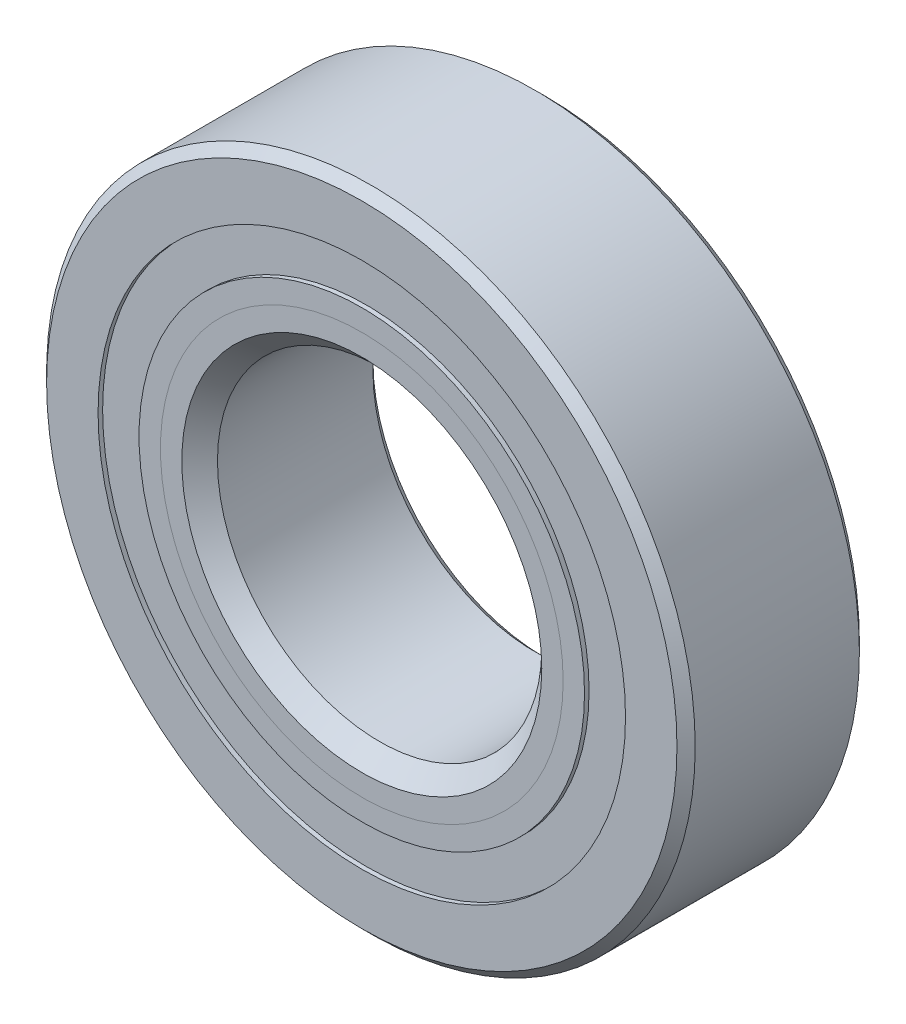
ISO-10303-21;
HEADER;
FILE_DESCRIPTION(('STEP AP214'),'2;1');
FILE_NAME('part.step','',(''),(''),'','','');
FILE_SCHEMA(('AUTOMOTIVE_DESIGN { 1 0 10303 214 1 1 1 1 }'));
ENDSEC;
DATA;
#1=APPLICATION_CONTEXT('core data for automotive mechanical design processes');
#2=APPLICATION_PROTOCOL_DEFINITION('international standard','automotive_design',2000,#1);
#3=PRODUCT_CONTEXT('',#1,'mechanical');
#4=PRODUCT('Part','Part','',(#3));
#5=PRODUCT_RELATED_PRODUCT_CATEGORY('part','',(#4));
#6=PRODUCT_DEFINITION_FORMATION('','',#4);
#7=PRODUCT_DEFINITION_CONTEXT('part definition',#1,'design');
#8=PRODUCT_DEFINITION('design','',#6,#7);
#9=PRODUCT_DEFINITION_SHAPE('','',#8);
#10=(LENGTH_UNIT() NAMED_UNIT(*) SI_UNIT(.MILLI.,.METRE.));
#11=(NAMED_UNIT(*) PLANE_ANGLE_UNIT() SI_UNIT($,.RADIAN.));
#12=(NAMED_UNIT(*) SI_UNIT($,.STERADIAN.) SOLID_ANGLE_UNIT());
#13=UNCERTAINTY_MEASURE_WITH_UNIT(LENGTH_MEASURE(1.E-05),#10,'distance_accuracy_value','');
#14=(GEOMETRIC_REPRESENTATION_CONTEXT(3) GLOBAL_UNCERTAINTY_ASSIGNED_CONTEXT((#13)) GLOBAL_UNIT_ASSIGNED_CONTEXT((#10,
#11,#12)) REPRESENTATION_CONTEXT('',''));
#15=CARTESIAN_POINT('',(0.,0.,0.));
#16=DIRECTION('',(0.,0.,1.));
#17=DIRECTION('',(1.,0.,0.));
#18=AXIS2_PLACEMENT_3D('',#15,#16,#17);
#19=CARTESIAN_POINT('',(0.,20.654945054945,-6.78656250000001));
#20=DIRECTION('',(0.,0.,1.));
#21=DIRECTION('',(1.,0.,0.));
#22=AXIS2_PLACEMENT_3D('',#19,#20,#21);
#23=PLANE('',#22);
#24=CARTESIAN_POINT('',(0.,0.,-6.78656250000001));
#25=DIRECTION('',(0.,0.,1.));
#26=DIRECTION('',(1.,0.,0.));
#27=AXIS2_PLACEMENT_3D('',#24,#25,#26);
#28=CIRCLE('',#27,20.654945054945);
#29=CARTESIAN_POINT('',(20.654945054945,0.,-6.78656250000001));
#30=VERTEX_POINT('',#29);
#31=EDGE_CURVE('E72',#30,#30,#28,.T.);
#32=ORIENTED_EDGE('',*,*,#31,.F.);
#33=EDGE_LOOP('',(#32));
#34=FACE_BOUND('',#33,.T.);
#35=CARTESIAN_POINT('',(0.,0.,-6.78656250000001));
#36=DIRECTION('',(0.,0.,1.));
#37=DIRECTION('',(1.,0.,0.));
#38=AXIS2_PLACEMENT_3D('',#35,#36,#37);
#39=CIRCLE('',#38,17.4450549450549);
#40=CARTESIAN_POINT('',(17.4450549450549,0.,-6.78656250000001));
#41=VERTEX_POINT('',#40);
#42=EDGE_CURVE('E13',#41,#41,#39,.T.);
#43=ORIENTED_EDGE('',*,*,#42,.T.);
#44=EDGE_LOOP('',(#43));
#45=FACE_BOUND('',#44,.T.);
#46=ADVANCED_FACE('F58',(#34,#45),#23,.F.);
#47=CARTESIAN_POINT('',(0.,0.,7.14375));
#48=DIRECTION('',(0.,0.,1.));
#49=DIRECTION('',(1.,0.,0.));
#50=AXIS2_PLACEMENT_3D('',#47,#48,#49);
#51=CYLINDRICAL_SURFACE('',#50,17.4450549450549);
#52=ORIENTED_EDGE('',*,*,#42,.F.);
#53=EDGE_LOOP('',(#52));
#54=FACE_BOUND('',#53,.T.);
#55=CARTESIAN_POINT('',(0.,0.,-3.55759379769425));
#56=DIRECTION('',(0.,0.,1.));
#57=DIRECTION('',(1.,0.,0.));
#58=AXIS2_PLACEMENT_3D('',#55,#56,#57);
#59=CIRCLE('',#58,17.4450549450549);
#60=CARTESIAN_POINT('',(17.4450549450549,0.,-3.55759379769425));
#61=VERTEX_POINT('',#60);
#62=EDGE_CURVE('E64',#61,#61,#59,.T.);
#63=ORIENTED_EDGE('',*,*,#62,.T.);
#64=EDGE_LOOP('',(#63));
#65=FACE_BOUND('',#64,.T.);
#66=ADVANCED_FACE('F81',(#54,#65),#51,.F.);
#67=CARTESIAN_POINT('',(0.,20.654945054945,-3.55759379769425));
#68=DIRECTION('',(0.,0.,-1.));
#69=DIRECTION('',(-1.,0.,0.));
#70=AXIS2_PLACEMENT_3D('',#67,#68,#69);
#71=PLANE('',#70);
#72=ORIENTED_EDGE('',*,*,#62,.F.);
#73=EDGE_LOOP('',(#72));
#74=FACE_BOUND('',#73,.T.);
#75=CARTESIAN_POINT('',(0.,0.,-3.55759379769425));
#76=DIRECTION('',(0.,0.,1.));
#77=DIRECTION('',(1.,0.,0.));
#78=AXIS2_PLACEMENT_3D('',#75,#76,#77);
#79=CIRCLE('',#78,20.654945054945);
#80=CARTESIAN_POINT('',(20.654945054945,0.,-3.55759379769425));
#81=VERTEX_POINT('',#80);
#82=EDGE_CURVE('E68',#81,#81,#79,.T.);
#83=ORIENTED_EDGE('',*,*,#82,.T.);
#84=EDGE_LOOP('',(#83));
#85=FACE_BOUND('',#84,.T.);
#86=ADVANCED_FACE('F85',(#74,#85),#71,.F.);
#87=CARTESIAN_POINT('',(0.,0.,7.14375));
#88=DIRECTION('',(0.,0.,1.));
#89=DIRECTION('',(1.,0.,0.));
#90=AXIS2_PLACEMENT_3D('',#87,#88,#89);
#91=CYLINDRICAL_SURFACE('',#90,20.654945054945);
#92=ORIENTED_EDGE('',*,*,#82,.F.);
#93=EDGE_LOOP('',(#92));
#94=FACE_BOUND('',#93,.T.);
#95=ORIENTED_EDGE('',*,*,#31,.T.);
#96=EDGE_LOOP('',(#95));
#97=FACE_BOUND('',#96,.T.);
#98=ADVANCED_FACE('F78',(#94,#97),#91,.T.);
#99=CLOSED_SHELL('',(#46,#66,#86,#98));
#100=MANIFOLD_SOLID_BREP('B2',#99);
#101=CARTESIAN_POINT('',(0.,20.654945054945,6.7865625));
#102=DIRECTION('',(0.,0.,-1.));
#103=DIRECTION('',(-1.,0.,0.));
#104=AXIS2_PLACEMENT_3D('',#101,#102,#103);
#105=PLANE('',#104);
#106=CARTESIAN_POINT('',(0.,0.,6.7865625));
#107=DIRECTION('',(0.,0.,1.));
#108=DIRECTION('',(1.,0.,0.));
#109=AXIS2_PLACEMENT_3D('',#106,#107,#108);
#110=CIRCLE('',#109,17.4450549450549);
#111=CARTESIAN_POINT('',(17.4450549450549,0.,6.7865625));
#112=VERTEX_POINT('',#111);
#113=EDGE_CURVE('E57',#112,#112,#110,.T.);
#114=ORIENTED_EDGE('',*,*,#113,.F.);
#115=EDGE_LOOP('',(#114));
#116=FACE_BOUND('',#115,.T.);
#117=CARTESIAN_POINT('',(0.,0.,6.7865625));
#118=DIRECTION('',(0.,0.,1.));
#119=DIRECTION('',(1.,0.,0.));
#120=AXIS2_PLACEMENT_3D('',#117,#118,#119);
#121=CIRCLE('',#120,20.654945054945);
#122=CARTESIAN_POINT('',(20.654945054945,0.,6.7865625));
#123=VERTEX_POINT('',#122);
#124=EDGE_CURVE('E146',#123,#123,#121,.T.);
#125=ORIENTED_EDGE('',*,*,#124,.T.);
#126=EDGE_LOOP('',(#125));
#127=FACE_BOUND('',#126,.T.);
#128=ADVANCED_FACE('F132',(#116,#127),#105,.F.);
#129=CARTESIAN_POINT('',(0.,0.,7.14375));
#130=DIRECTION('',(0.,0.,1.));
#131=DIRECTION('',(1.,0.,0.));
#132=AXIS2_PLACEMENT_3D('',#129,#130,#131);
#133=CYLINDRICAL_SURFACE('',#132,17.4450549450549);
#134=CARTESIAN_POINT('',(0.,0.,3.55759379769425));
#135=DIRECTION('',(0.,0.,1.));
#136=DIRECTION('',(1.,0.,0.));
#137=AXIS2_PLACEMENT_3D('',#134,#135,#136);
#138=CIRCLE('',#137,17.4450549450549);
#139=CARTESIAN_POINT('',(17.4450549450549,0.,3.55759379769425));
#140=VERTEX_POINT('',#139);
#141=EDGE_CURVE('E138',#140,#140,#138,.T.);
#142=ORIENTED_EDGE('',*,*,#141,.F.);
#143=EDGE_LOOP('',(#142));
#144=FACE_BOUND('',#143,.T.);
#145=ORIENTED_EDGE('',*,*,#113,.T.);
#146=EDGE_LOOP('',(#145));
#147=FACE_BOUND('',#146,.T.);
#148=ADVANCED_FACE('F161',(#144,#147),#133,.F.);
#149=CARTESIAN_POINT('',(0.,20.654945054945,3.55759379769425));
#150=DIRECTION('',(0.,0.,1.));
#151=DIRECTION('',(1.,0.,0.));
#152=AXIS2_PLACEMENT_3D('',#149,#150,#151);
#153=PLANE('',#152);
#154=CARTESIAN_POINT('',(0.,0.,3.55759379769425));
#155=DIRECTION('',(0.,0.,1.));
#156=DIRECTION('',(1.,0.,0.));
#157=AXIS2_PLACEMENT_3D('',#154,#155,#156);
#158=CIRCLE('',#157,20.654945054945);
#159=CARTESIAN_POINT('',(20.654945054945,0.,3.55759379769425));
#160=VERTEX_POINT('',#159);
#161=EDGE_CURVE('E142',#160,#160,#158,.T.);
#162=ORIENTED_EDGE('',*,*,#161,.F.);
#163=EDGE_LOOP('',(#162));
#164=FACE_BOUND('',#163,.T.);
#165=ORIENTED_EDGE('',*,*,#141,.T.);
#166=EDGE_LOOP('',(#165));
#167=FACE_BOUND('',#166,.T.);
#168=ADVANCED_FACE('F156',(#164,#167),#153,.F.);
#169=CARTESIAN_POINT('',(0.,0.,7.14375));
#170=DIRECTION('',(0.,0.,1.));
#171=DIRECTION('',(1.,0.,0.));
#172=AXIS2_PLACEMENT_3D('',#169,#170,#171);
#173=CYLINDRICAL_SURFACE('',#172,20.654945054945);
#174=ORIENTED_EDGE('',*,*,#124,.F.);
#175=EDGE_LOOP('',(#174));
#176=FACE_BOUND('',#175,.T.);
#177=ORIENTED_EDGE('',*,*,#161,.T.);
#178=EDGE_LOOP('',(#177));
#179=FACE_BOUND('',#178,.T.);
#180=ADVANCED_FACE('F153',(#176,#179),#173,.T.);
#181=CLOSED_SHELL('',(#128,#148,#168,#180));
#182=MANIFOLD_SOLID_BREP('B8',#181);
#183=CARTESIAN_POINT('',(-9.52499999999979,16.4977839420937,0.));
#184=DIRECTION('',(0.,0.,1.));
#185=DIRECTION('',(-0.499999999999989,0.866025403784445,0.));
#186=AXIS2_PLACEMENT_3D('',#183,#184,#185);
#187=SPHERICAL_SURFACE('',#186,3.55759379769425);
#188=CARTESIAN_POINT('',(-9.52499999999979,16.4977839420937,3.55759379769425));
#189=VERTEX_POINT('',#188);
#190=VERTEX_LOOP('',#189);
#191=FACE_BOUND('',#190,.T.);
#192=ADVANCED_FACE('F200',(#191),#187,.T.);
#193=CLOSED_SHELL('',(#192));
#194=MANIFOLD_SOLID_BREP('B52',#193);
#195=CARTESIAN_POINT('',(-16.4977839420934,9.52500000000019,0.));
#196=DIRECTION('',(0.,0.,1.));
#197=DIRECTION('',(-0.866025403784433,0.50000000000001,0.));
#198=AXIS2_PLACEMENT_3D('',#195,#196,#197);
#199=SPHERICAL_SURFACE('',#198,3.55759379769425);
#200=CARTESIAN_POINT('',(-16.4977839420934,9.52500000000019,3.55759379769425));
#201=VERTEX_POINT('',#200);
#202=VERTEX_LOOP('',#201);
#203=FACE_BOUND('',#202,.T.);
#204=ADVANCED_FACE('F233',(#203),#199,.T.);
#205=CLOSED_SHELL('',(#204));
#206=MANIFOLD_SOLID_BREP('B128',#205);
#207=CARTESIAN_POINT('',(-19.05,1.99538158514885E-13,0.));
#208=DIRECTION('',(0.,0.,1.));
#209=DIRECTION('',(-1.,0.,0.));
#210=AXIS2_PLACEMENT_3D('',#207,#208,#209);
#211=SPHERICAL_SURFACE('',#210,3.55759379769425);
#212=CARTESIAN_POINT('',(-19.05,1.99538158514885E-13,3.55759379769425));
#213=VERTEX_POINT('',#212);
#214=VERTEX_LOOP('',#213);
#215=FACE_BOUND('',#214,.T.);
#216=ADVANCED_FACE('F266',(#215),#211,.T.);
#217=CLOSED_SHELL('',(#216));
#218=MANIFOLD_SOLID_BREP('B196',#217);
#219=CARTESIAN_POINT('',(-16.4977839420936,-9.52499999999985,0.));
#220=DIRECTION('',(0.,0.,1.));
#221=DIRECTION('',(-0.866025403784443,-0.499999999999992,0.));
#222=AXIS2_PLACEMENT_3D('',#219,#220,#221);
#223=SPHERICAL_SURFACE('',#222,3.55759379769425);
#224=CARTESIAN_POINT('',(-16.4977839420936,-9.52499999999985,3.55759379769425));
#225=VERTEX_POINT('',#224);
#226=VERTEX_LOOP('',#225);
#227=FACE_BOUND('',#226,.T.);
#228=ADVANCED_FACE('F299',(#227),#223,.T.);
#229=CLOSED_SHELL('',(#228));
#230=MANIFOLD_SOLID_BREP('B229',#229);
#231=CARTESIAN_POINT('',(-9.52500000000013,-16.4977839420935,0.));
#232=DIRECTION('',(0.,0.,1.));
#233=DIRECTION('',(-0.500000000000007,-0.866025403784435,0.));
#234=AXIS2_PLACEMENT_3D('',#231,#232,#233);
#235=SPHERICAL_SURFACE('',#234,3.55759379769425);
#236=CARTESIAN_POINT('',(-9.52500000000013,-16.4977839420935,3.55759379769425));
#237=VERTEX_POINT('',#236);
#238=VERTEX_LOOP('',#237);
#239=FACE_BOUND('',#238,.T.);
#240=ADVANCED_FACE('F333',(#239),#235,.T.);
#241=CLOSED_SHELL('',(#240));
#242=MANIFOLD_SOLID_BREP('B262',#241);
#243=CARTESIAN_POINT('',(-1.33025439009923E-13,-19.05,0.));
#244=DIRECTION('',(0.,0.,1.));
#245=DIRECTION('',(0.,-1.,0.));
#246=AXIS2_PLACEMENT_3D('',#243,#244,#245);
#247=SPHERICAL_SURFACE('',#246,3.55759379769425);
#248=CARTESIAN_POINT('',(-1.33025439009923E-13,-19.05,3.55759379769425));
#249=VERTEX_POINT('',#248);
#250=VERTEX_LOOP('',#249);
#251=FACE_BOUND('',#250,.T.);
#252=ADVANCED_FACE('F370',(#251),#247,.T.);
#253=CLOSED_SHELL('',(#252));
#254=MANIFOLD_SOLID_BREP('B295',#253);
#255=CARTESIAN_POINT('',(9.5249999999999,-16.4977839420936,0.));
#256=DIRECTION('',(0.,0.,1.));
#257=DIRECTION('',(0.499999999999995,-0.866025403784442,0.));
#258=AXIS2_PLACEMENT_3D('',#255,#256,#257);
#259=SPHERICAL_SURFACE('',#258,3.55759379769425);
#260=CARTESIAN_POINT('',(9.5249999999999,-16.4977839420936,3.55759379769425));
#261=VERTEX_POINT('',#260);
#262=VERTEX_LOOP('',#261);
#263=FACE_BOUND('',#262,.T.);
#264=ADVANCED_FACE('F404',(#263),#259,.T.);
#265=CLOSED_SHELL('',(#264));
#266=MANIFOLD_SOLID_BREP('B329',#265);
#267=CARTESIAN_POINT('',(16.4977839420935,-9.52500000000008,0.));
#268=DIRECTION('',(0.,0.,1.));
#269=DIRECTION('',(0.866025403784436,-0.500000000000004,0.));
#270=AXIS2_PLACEMENT_3D('',#267,#268,#269);
#271=SPHERICAL_SURFACE('',#270,3.55759379769425);
#272=CARTESIAN_POINT('',(16.4977839420935,-9.52500000000008,3.55759379769425));
#273=VERTEX_POINT('',#272);
#274=VERTEX_LOOP('',#273);
#275=FACE_BOUND('',#274,.T.);
#276=ADVANCED_FACE('F436',(#275),#271,.T.);
#277=CLOSED_SHELL('',(#276));
#278=MANIFOLD_SOLID_BREP('B366',#277);
#279=CARTESIAN_POINT('',(19.05,0.,0.));
#280=DIRECTION('',(0.,0.,1.));
#281=DIRECTION('',(1.,0.,0.));
#282=AXIS2_PLACEMENT_3D('',#279,#280,#281);
#283=SPHERICAL_SURFACE('',#282,3.55759379769425);
#284=CARTESIAN_POINT('',(19.05,0.,3.55759379769425));
#285=VERTEX_POINT('',#284);
#286=VERTEX_LOOP('',#285);
#287=FACE_BOUND('',#286,.T.);
#288=ADVANCED_FACE('F473',(#287),#283,.T.);
#289=CLOSED_SHELL('',(#288));
#290=MANIFOLD_SOLID_BREP('B400',#289);
#291=CARTESIAN_POINT('',(16.4977839420936,9.52499999999996,0.));
#292=DIRECTION('',(0.,0.,1.));
#293=DIRECTION('',(0.86602540378444,0.499999999999998,0.));
#294=AXIS2_PLACEMENT_3D('',#291,#292,#293);
#295=SPHERICAL_SURFACE('',#294,3.55759379769425);
#296=CARTESIAN_POINT('',(16.4977839420936,9.52499999999996,3.55759379769425));
#297=VERTEX_POINT('',#296);
#298=VERTEX_LOOP('',#297);
#299=FACE_BOUND('',#298,.T.);
#300=ADVANCED_FACE('F508',(#299),#295,.T.);
#301=CLOSED_SHELL('',(#300));
#302=MANIFOLD_SOLID_BREP('B432',#301);
#303=CARTESIAN_POINT('',(9.52500000000002,16.4977839420935,0.));
#304=DIRECTION('',(0.,0.,1.));
#305=DIRECTION('',(0.500000000000001,0.866025403784438,0.));
#306=AXIS2_PLACEMENT_3D('',#303,#304,#305);
#307=SPHERICAL_SURFACE('',#306,3.55759379769425);
#308=CARTESIAN_POINT('',(9.52500000000002,16.4977839420935,3.55759379769425));
#309=VERTEX_POINT('',#308);
#310=VERTEX_LOOP('',#309);
#311=FACE_BOUND('',#310,.T.);
#312=ADVANCED_FACE('F543',(#311),#307,.T.);
#313=CLOSED_SHELL('',(#312));
#314=MANIFOLD_SOLID_BREP('B469',#313);
#315=CARTESIAN_POINT('',(0.,19.05,0.));
#316=DIRECTION('',(0.,0.,1.));
#317=DIRECTION('',(0.,1.,0.));
#318=AXIS2_PLACEMENT_3D('',#315,#316,#317);
#319=SPHERICAL_SURFACE('',#318,3.55759379769425);
#320=CARTESIAN_POINT('',(0.,19.05,3.55759379769425));
#321=VERTEX_POINT('',#320);
#322=VERTEX_LOOP('',#321);
#323=FACE_BOUND('',#322,.T.);
#324=ADVANCED_FACE('F578',(#323),#319,.T.);
#325=CLOSED_SHELL('',(#324));
#326=MANIFOLD_SOLID_BREP('B504',#325);
#327=CARTESIAN_POINT('',(0.,15.7706290231039,7.14375));
#328=DIRECTION('',(0.,0.,-1.));
#329=DIRECTION('',(-1.,0.,0.));
#330=AXIS2_PLACEMENT_3D('',#327,#328,#329);
#331=PLANE('',#330);
#332=CARTESIAN_POINT('',(0.,0.,7.14375));
#333=DIRECTION('',(0.,0.,1.));
#334=DIRECTION('',(1.,0.,0.));
#335=AXIS2_PLACEMENT_3D('',#332,#333,#334);
#336=CIRCLE('',#335,14.0962031011529);
#337=CARTESIAN_POINT('',(14.0962031011529,0.,7.14375));
#338=VERTEX_POINT('',#337);
#339=EDGE_CURVE('E641',#338,#338,#336,.T.);
#340=ORIENTED_EDGE('',*,*,#339,.F.);
#341=EDGE_LOOP('',(#340));
#342=FACE_BOUND('',#341,.T.);
#343=CARTESIAN_POINT('',(0.,0.,7.14375));
#344=DIRECTION('',(0.,0.,1.));
#345=DIRECTION('',(1.,0.,0.));
#346=AXIS2_PLACEMENT_3D('',#343,#344,#345);
#347=CIRCLE('',#346,15.7706290231039);
#348=CARTESIAN_POINT('',(15.7706290231039,0.,7.14375));
#349=VERTEX_POINT('',#348);
#350=EDGE_CURVE('E577',#349,#349,#347,.T.);
#351=ORIENTED_EDGE('',*,*,#350,.T.);
#352=EDGE_LOOP('',(#351));
#353=FACE_BOUND('',#352,.T.);
#354=ADVANCED_FACE('F607',(#342,#353),#331,.F.);
#355=CARTESIAN_POINT('',(0.,0.,5.46932407804898));
#356=DIRECTION('',(0.,0.,1.));
#357=DIRECTION('',(1.,0.,0.));
#358=AXIS2_PLACEMENT_3D('',#355,#356,#357);
#359=CONICAL_SURFACE('',#358,14.0962031011529,0.78539816339745);
#360=ORIENTED_EDGE('',*,*,#350,.F.);
#361=EDGE_LOOP('',(#360));
#362=FACE_BOUND('',#361,.T.);
#363=CARTESIAN_POINT('',(0.,0.,5.46932407804898));
#364=DIRECTION('',(0.,0.,1.));
#365=DIRECTION('',(1.,0.,0.));
#366=AXIS2_PLACEMENT_3D('',#363,#364,#365);
#367=CIRCLE('',#366,14.0962031011529);
#368=CARTESIAN_POINT('',(14.0962031011529,0.,5.46932407804898));
#369=VERTEX_POINT('',#368);
#370=EDGE_CURVE('E613',#369,#369,#367,.T.);
#371=ORIENTED_EDGE('',*,*,#370,.T.);
#372=EDGE_LOOP('',(#371));
#373=FACE_BOUND('',#372,.T.);
#374=ADVANCED_FACE('F648',(#362,#373),#359,.T.);
#375=CARTESIAN_POINT('',(0.,0.,7.14375));
#376=DIRECTION('',(0.,0.,1.));
#377=DIRECTION('',(1.,0.,0.));
#378=AXIS2_PLACEMENT_3D('',#375,#376,#377);
#379=CYLINDRICAL_SURFACE('',#378,14.0962031011529);
#380=ORIENTED_EDGE('',*,*,#370,.F.);
#381=EDGE_LOOP('',(#380));
#382=FACE_BOUND('',#381,.T.);
#383=CARTESIAN_POINT('',(0.,0.,0.));
#384=DIRECTION('',(0.,0.,1.));
#385=DIRECTION('',(1.,0.,0.));
#386=AXIS2_PLACEMENT_3D('',#383,#384,#385);
#387=CIRCLE('',#386,14.0962031011529);
#388=CARTESIAN_POINT('',(14.0962031011529,0.,0.));
#389=VERTEX_POINT('',#388);
#390=EDGE_CURVE('E617',#389,#389,#387,.T.);
#391=ORIENTED_EDGE('',*,*,#390,.T.);
#392=EDGE_LOOP('',(#391));
#393=FACE_BOUND('',#392,.T.);
#394=ADVANCED_FACE('F652',(#382,#393),#379,.T.);
#395=CARTESIAN_POINT('',(0.,14.0962031011529,0.));
#396=DIRECTION('',(0.,0.,-1.));
#397=DIRECTION('',(-1.,0.,0.));
#398=AXIS2_PLACEMENT_3D('',#395,#396,#397);
#399=PLANE('',#398);
#400=ORIENTED_EDGE('',*,*,#390,.F.);
#401=EDGE_LOOP('',(#400));
#402=FACE_BOUND('',#401,.T.);
#403=CARTESIAN_POINT('',(0.,0.,0.));
#404=DIRECTION('',(0.,0.,1.));
#405=DIRECTION('',(1.,0.,0.));
#406=AXIS2_PLACEMENT_3D('',#403,#404,#405);
#407=CIRCLE('',#406,15.4924062023057);
#408=CARTESIAN_POINT('',(15.4924062023057,0.,0.));
#409=VERTEX_POINT('',#408);
#410=EDGE_CURVE('E621',#409,#409,#407,.T.);
#411=ORIENTED_EDGE('',*,*,#410,.T.);
#412=EDGE_LOOP('',(#411));
#413=FACE_BOUND('',#412,.T.);
#414=ADVANCED_FACE('F657',(#402,#413),#399,.F.);
#415=CARTESIAN_POINT('',(0.,0.,0.));
#416=DIRECTION('',(0.,0.,1.));
#417=DIRECTION('',(1.,0.,0.));
#418=AXIS2_PLACEMENT_3D('',#415,#416,#417);
#419=TOROIDAL_SURFACE('',#418,19.05,3.55759379769425);
#420=ORIENTED_EDGE('',*,*,#410,.F.);
#421=EDGE_LOOP('',(#420));
#422=FACE_BOUND('',#421,.T.);
#423=CARTESIAN_POINT('',(0.,0.,-3.175));
#424=DIRECTION('',(0.,0.,1.));
#425=DIRECTION('',(1.,0.,0.));
#426=AXIS2_PLACEMENT_3D('',#423,#424,#425);
#427=CIRCLE('',#426,17.4450549450549);
#428=CARTESIAN_POINT('',(17.4450549450549,0.,-3.175));
#429=VERTEX_POINT('',#428);
#430=EDGE_CURVE('E626',#429,#429,#427,.T.);
#431=ORIENTED_EDGE('',*,*,#430,.T.);
#432=EDGE_LOOP('',(#431));
#433=FACE_BOUND('',#432,.T.);
#434=ADVANCED_FACE('F663',(#422,#433),#419,.F.);
#435=CARTESIAN_POINT('',(0.,0.,7.14375));
#436=DIRECTION('',(0.,0.,1.));
#437=DIRECTION('',(1.,0.,0.));
#438=AXIS2_PLACEMENT_3D('',#435,#436,#437);
#439=CYLINDRICAL_SURFACE('',#438,17.4450549450549);
#440=ORIENTED_EDGE('',*,*,#430,.F.);
#441=EDGE_LOOP('',(#440));
#442=FACE_BOUND('',#441,.T.);
#443=CARTESIAN_POINT('',(0.,0.,-7.14375000000001));
#444=DIRECTION('',(0.,0.,1.));
#445=DIRECTION('',(1.,0.,0.));
#446=AXIS2_PLACEMENT_3D('',#443,#444,#445);
#447=CIRCLE('',#446,17.4450549450549);
#448=CARTESIAN_POINT('',(17.4450549450549,0.,-7.14375000000001));
#449=VERTEX_POINT('',#448);
#450=EDGE_CURVE('E629',#449,#449,#447,.T.);
#451=ORIENTED_EDGE('',*,*,#450,.T.);
#452=EDGE_LOOP('',(#451));
#453=FACE_BOUND('',#452,.T.);
#454=ADVANCED_FACE('F667',(#442,#453),#439,.T.);
#455=CARTESIAN_POINT('',(0.,13.414375,-7.14375000000001));
#456=DIRECTION('',(0.,0.,1.));
#457=DIRECTION('',(1.,0.,0.));
#458=AXIS2_PLACEMENT_3D('',#455,#456,#457);
#459=PLANE('',#458);
#460=ORIENTED_EDGE('',*,*,#450,.F.);
#461=EDGE_LOOP('',(#460));
#462=FACE_BOUND('',#461,.T.);
#463=CARTESIAN_POINT('',(0.,0.,-7.14375000000001));
#464=DIRECTION('',(0.,0.,1.));
#465=DIRECTION('',(1.,0.,0.));
#466=AXIS2_PLACEMENT_3D('',#463,#464,#465);
#467=CIRCLE('',#466,13.414375);
#468=CARTESIAN_POINT('',(13.414375,0.,-7.14375000000001));
#469=VERTEX_POINT('',#468);
#470=EDGE_CURVE('E632',#469,#469,#467,.T.);
#471=ORIENTED_EDGE('',*,*,#470,.T.);
#472=EDGE_LOOP('',(#471));
#473=FACE_BOUND('',#472,.T.);
#474=ADVANCED_FACE('F671',(#462,#473),#459,.F.);
#475=CARTESIAN_POINT('',(0.,0.,-6.42937500000001));
#476=DIRECTION('',(0.,0.,-1.));
#477=DIRECTION('',(-1.,0.,0.));
#478=AXIS2_PLACEMENT_3D('',#475,#476,#477);
#479=CONICAL_SURFACE('',#478,12.7,0.785398163397445);
#480=ORIENTED_EDGE('',*,*,#470,.F.);
#481=EDGE_LOOP('',(#480));
#482=FACE_BOUND('',#481,.T.);
#483=CARTESIAN_POINT('',(0.,0.,-6.42937500000001));
#484=DIRECTION('',(0.,0.,1.));
#485=DIRECTION('',(1.,0.,0.));
#486=AXIS2_PLACEMENT_3D('',#483,#484,#485);
#487=CIRCLE('',#486,12.7);
#488=CARTESIAN_POINT('',(12.7,0.,-6.42937500000001));
#489=VERTEX_POINT('',#488);
#490=EDGE_CURVE('E635',#489,#489,#487,.T.);
#491=ORIENTED_EDGE('',*,*,#490,.T.);
#492=EDGE_LOOP('',(#491));
#493=FACE_BOUND('',#492,.T.);
#494=ADVANCED_FACE('F675',(#482,#493),#479,.F.);
#495=CARTESIAN_POINT('',(0.,0.,7.14375));
#496=DIRECTION('',(0.,0.,1.));
#497=DIRECTION('',(1.,0.,0.));
#498=AXIS2_PLACEMENT_3D('',#495,#496,#497);
#499=CYLINDRICAL_SURFACE('',#498,12.7);
#500=ORIENTED_EDGE('',*,*,#490,.F.);
#501=EDGE_LOOP('',(#500));
#502=FACE_BOUND('',#501,.T.);
#503=CARTESIAN_POINT('',(0.,0.,5.74754689884713));
#504=DIRECTION('',(0.,0.,1.));
#505=DIRECTION('',(1.,0.,0.));
#506=AXIS2_PLACEMENT_3D('',#503,#504,#505);
#507=CIRCLE('',#506,12.7);
#508=CARTESIAN_POINT('',(12.7,0.,5.74754689884713));
#509=VERTEX_POINT('',#508);
#510=EDGE_CURVE('E638',#509,#509,#507,.T.);
#511=ORIENTED_EDGE('',*,*,#510,.T.);
#512=EDGE_LOOP('',(#511));
#513=FACE_BOUND('',#512,.T.);
#514=ADVANCED_FACE('F679',(#502,#513),#499,.F.);
#515=CARTESIAN_POINT('',(0.,0.,7.14375));
#516=DIRECTION('',(0.,0.,1.));
#517=DIRECTION('',(1.,0.,0.));
#518=AXIS2_PLACEMENT_3D('',#515,#516,#517);
#519=CONICAL_SURFACE('',#518,14.0962031011529,0.78539816339745);
#520=ORIENTED_EDGE('',*,*,#510,.F.);
#521=EDGE_LOOP('',(#520));
#522=FACE_BOUND('',#521,.T.);
#523=ORIENTED_EDGE('',*,*,#339,.T.);
#524=EDGE_LOOP('',(#523));
#525=FACE_BOUND('',#524,.T.);
#526=ADVANCED_FACE('F645',(#522,#525),#519,.F.);
#527=CLOSED_SHELL('',(#354,#374,#394,#414,#434,#454,#474,#494,#514,#526));
#528=MANIFOLD_SOLID_BREP('B539',#527);
#529=CARTESIAN_POINT('',(0.,17.4450549450549,7.14375));
#530=DIRECTION('',(0.,0.,-1.));
#531=DIRECTION('',(-1.,0.,0.));
#532=AXIS2_PLACEMENT_3D('',#529,#530,#531);
#533=PLANE('',#532);
#534=CARTESIAN_POINT('',(0.,0.,7.14375));
#535=DIRECTION('',(0.,0.,1.));
#536=DIRECTION('',(1.,0.,0.));
#537=AXIS2_PLACEMENT_3D('',#534,#535,#536);
#538=CIRCLE('',#537,15.7706290231039);
#539=CARTESIAN_POINT('',(15.7706290231039,0.,7.14375));
#540=VERTEX_POINT('',#539);
#541=EDGE_CURVE('E606',#540,#540,#538,.T.);
#542=ORIENTED_EDGE('',*,*,#541,.F.);
#543=EDGE_LOOP('',(#542));
#544=FACE_BOUND('',#543,.T.);
#545=CARTESIAN_POINT('',(0.,0.,7.14375));
#546=DIRECTION('',(0.,0.,1.));
#547=DIRECTION('',(1.,0.,0.));
#548=AXIS2_PLACEMENT_3D('',#545,#546,#547);
#549=CIRCLE('',#548,17.4450549450549);
#550=CARTESIAN_POINT('',(17.4450549450549,0.,7.14375));
#551=VERTEX_POINT('',#550);
#552=EDGE_CURVE('E796',#551,#551,#549,.T.);
#553=ORIENTED_EDGE('',*,*,#552,.T.);
#554=EDGE_LOOP('',(#553));
#555=FACE_BOUND('',#554,.T.);
#556=ADVANCED_FACE('F774',(#544,#555),#533,.F.);
#557=CARTESIAN_POINT('',(0.,0.,7.14375));
#558=DIRECTION('',(0.,0.,1.));
#559=DIRECTION('',(1.,0.,0.));
#560=AXIS2_PLACEMENT_3D('',#557,#558,#559);
#561=CONICAL_SURFACE('',#560,15.7706290231039,0.78539816339745);
#562=CARTESIAN_POINT('',(0.,0.,5.46932407804898));
#563=DIRECTION('',(0.,0.,1.));
#564=DIRECTION('',(1.,0.,0.));
#565=AXIS2_PLACEMENT_3D('',#562,#563,#564);
#566=CIRCLE('',#565,14.0962031011529);
#567=CARTESIAN_POINT('',(14.0962031011529,0.,5.46932407804898));
#568=VERTEX_POINT('',#567);
#569=EDGE_CURVE('E780',#568,#568,#566,.T.);
#570=ORIENTED_EDGE('',*,*,#569,.F.);
#571=EDGE_LOOP('',(#570));
#572=FACE_BOUND('',#571,.T.);
#573=ORIENTED_EDGE('',*,*,#541,.T.);
#574=EDGE_LOOP('',(#573));
#575=FACE_BOUND('',#574,.T.);
#576=ADVANCED_FACE('F821',(#572,#575),#561,.F.);
#577=CARTESIAN_POINT('',(0.,0.,7.14375));
#578=DIRECTION('',(0.,0.,1.));
#579=DIRECTION('',(1.,0.,0.));
#580=AXIS2_PLACEMENT_3D('',#577,#578,#579);
#581=CYLINDRICAL_SURFACE('',#580,14.0962031011529);
#582=CARTESIAN_POINT('',(0.,0.,0.));
#583=DIRECTION('',(0.,0.,1.));
#584=DIRECTION('',(1.,0.,0.));
#585=AXIS2_PLACEMENT_3D('',#582,#583,#584);
#586=CIRCLE('',#585,14.0962031011529);
#587=CARTESIAN_POINT('',(14.0962031011529,0.,0.));
#588=VERTEX_POINT('',#587);
#589=EDGE_CURVE('E784',#588,#588,#586,.T.);
#590=ORIENTED_EDGE('',*,*,#589,.F.);
#591=EDGE_LOOP('',(#590));
#592=FACE_BOUND('',#591,.T.);
#593=ORIENTED_EDGE('',*,*,#569,.T.);
#594=EDGE_LOOP('',(#593));
#595=FACE_BOUND('',#594,.T.);
#596=ADVANCED_FACE('F816',(#592,#595),#581,.F.);
#597=CARTESIAN_POINT('',(0.,14.0962031011529,0.));
#598=DIRECTION('',(0.,0.,1.));
#599=DIRECTION('',(1.,0.,0.));
#600=AXIS2_PLACEMENT_3D('',#597,#598,#599);
#601=PLANE('',#600);
#602=CARTESIAN_POINT('',(0.,0.,0.));
#603=DIRECTION('',(0.,0.,1.));
#604=DIRECTION('',(1.,0.,0.));
#605=AXIS2_PLACEMENT_3D('',#602,#603,#604);
#606=CIRCLE('',#605,15.4924062023057);
#607=CARTESIAN_POINT('',(15.4924062023057,0.,0.));
#608=VERTEX_POINT('',#607);
#609=EDGE_CURVE('E788',#608,#608,#606,.T.);
#610=ORIENTED_EDGE('',*,*,#609,.F.);
#611=EDGE_LOOP('',(#610));
#612=FACE_BOUND('',#611,.T.);
#613=ORIENTED_EDGE('',*,*,#589,.T.);
#614=EDGE_LOOP('',(#613));
#615=FACE_BOUND('',#614,.T.);
#616=ADVANCED_FACE('F810',(#612,#615),#601,.F.);
#617=CARTESIAN_POINT('',(0.,0.,0.));
#618=DIRECTION('',(0.,0.,1.));
#619=DIRECTION('',(1.,0.,0.));
#620=AXIS2_PLACEMENT_3D('',#617,#618,#619);
#621=TOROIDAL_SURFACE('',#620,19.05,3.55759379769425);
#622=CARTESIAN_POINT('',(0.,0.,3.175));
#623=DIRECTION('',(0.,0.,1.));
#624=DIRECTION('',(1.,0.,0.));
#625=AXIS2_PLACEMENT_3D('',#622,#623,#624);
#626=CIRCLE('',#625,17.4450549450549);
#627=CARTESIAN_POINT('',(17.4450549450549,0.,3.175));
#628=VERTEX_POINT('',#627);
#629=EDGE_CURVE('E793',#628,#628,#626,.T.);
#630=ORIENTED_EDGE('',*,*,#629,.F.);
#631=EDGE_LOOP('',(#630));
#632=FACE_BOUND('',#631,.T.);
#633=ORIENTED_EDGE('',*,*,#609,.T.);
#634=EDGE_LOOP('',(#633));
#635=FACE_BOUND('',#634,.T.);
#636=ADVANCED_FACE('F804',(#632,#635),#621,.F.);
#637=CARTESIAN_POINT('',(0.,0.,7.14375));
#638=DIRECTION('',(0.,0.,1.));
#639=DIRECTION('',(1.,0.,0.));
#640=AXIS2_PLACEMENT_3D('',#637,#638,#639);
#641=CYLINDRICAL_SURFACE('',#640,17.4450549450549);
#642=ORIENTED_EDGE('',*,*,#552,.F.);
#643=EDGE_LOOP('',(#642));
#644=FACE_BOUND('',#643,.T.);
#645=ORIENTED_EDGE('',*,*,#629,.T.);
#646=EDGE_LOOP('',(#645));
#647=FACE_BOUND('',#646,.T.);
#648=ADVANCED_FACE('F801',(#644,#647),#641,.T.);
#649=CLOSED_SHELL('',(#556,#576,#596,#616,#636,#648));
#650=MANIFOLD_SOLID_BREP('B572',#649);
#651=CARTESIAN_POINT('',(0.,0.,6.429375));
#652=DIRECTION('',(0.,0.,-1.));
#653=DIRECTION('',(-1.,0.,0.));
#654=AXIS2_PLACEMENT_3D('',#651,#652,#653);
#655=CONICAL_SURFACE('',#654,25.4,0.785398163397446);
#656=CARTESIAN_POINT('',(0.,0.,7.14375));
#657=DIRECTION('',(0.,0.,1.));
#658=DIRECTION('',(1.,0.,0.));
#659=AXIS2_PLACEMENT_3D('',#656,#657,#658);
#660=CIRCLE('',#659,24.685625);
#661=CARTESIAN_POINT('',(24.685625,0.,7.14375));
#662=VERTEX_POINT('',#661);
#663=EDGE_CURVE('E900',#662,#662,#660,.T.);
#664=ORIENTED_EDGE('',*,*,#663,.F.);
#665=EDGE_LOOP('',(#664));
#666=FACE_BOUND('',#665,.T.);
#667=CARTESIAN_POINT('',(0.,0.,6.429375));
#668=DIRECTION('',(0.,0.,1.));
#669=DIRECTION('',(1.,0.,0.));
#670=AXIS2_PLACEMENT_3D('',#667,#668,#669);
#671=CIRCLE('',#670,25.4);
#672=CARTESIAN_POINT('',(25.4,0.,6.429375));
#673=VERTEX_POINT('',#672);
#674=EDGE_CURVE('E773',#673,#673,#671,.T.);
#675=ORIENTED_EDGE('',*,*,#674,.T.);
#676=EDGE_LOOP('',(#675));
#677=FACE_BOUND('',#676,.T.);
#678=ADVANCED_FACE('F872',(#666,#677),#655,.T.);
#679=CARTESIAN_POINT('',(0.,0.,7.14375));
#680=DIRECTION('',(0.,0.,1.));
#681=DIRECTION('',(1.,0.,0.));
#682=AXIS2_PLACEMENT_3D('',#679,#680,#681);
#683=CYLINDRICAL_SURFACE('',#682,25.4);
#684=ORIENTED_EDGE('',*,*,#674,.F.);
#685=EDGE_LOOP('',(#684));
#686=FACE_BOUND('',#685,.T.);
#687=CARTESIAN_POINT('',(0.,0.,-6.42937500000001));
#688=DIRECTION('',(0.,0.,1.));
#689=DIRECTION('',(1.,0.,0.));
#690=AXIS2_PLACEMENT_3D('',#687,#688,#689);
#691=CIRCLE('',#690,25.4);
#692=CARTESIAN_POINT('',(25.4,0.,-6.42937500000001));
#693=VERTEX_POINT('',#692);
#694=EDGE_CURVE('E878',#693,#693,#691,.T.);
#695=ORIENTED_EDGE('',*,*,#694,.T.);
#696=EDGE_LOOP('',(#695));
#697=FACE_BOUND('',#696,.T.);
#698=ADVANCED_FACE('F907',(#686,#697),#683,.T.);
#699=CARTESIAN_POINT('',(0.,0.,-7.14375000000001));
#700=DIRECTION('',(0.,0.,1.));
#701=DIRECTION('',(1.,0.,0.));
#702=AXIS2_PLACEMENT_3D('',#699,#700,#701);
#703=CONICAL_SURFACE('',#702,24.685625,0.785398163397444);
#704=ORIENTED_EDGE('',*,*,#694,.F.);
#705=EDGE_LOOP('',(#704));
#706=FACE_BOUND('',#705,.T.);
#707=CARTESIAN_POINT('',(0.,0.,-7.14375000000001));
#708=DIRECTION('',(0.,0.,1.));
#709=DIRECTION('',(1.,0.,0.));
#710=AXIS2_PLACEMENT_3D('',#707,#708,#709);
#711=CIRCLE('',#710,24.685625);
#712=CARTESIAN_POINT('',(24.685625,0.,-7.14375000000001));
#713=VERTEX_POINT('',#712);
#714=EDGE_CURVE('E882',#713,#713,#711,.T.);
#715=ORIENTED_EDGE('',*,*,#714,.T.);
#716=EDGE_LOOP('',(#715));
#717=FACE_BOUND('',#716,.T.);
#718=ADVANCED_FACE('F911',(#706,#717),#703,.T.);
#719=CARTESIAN_POINT('',(0.,24.685625,-7.14375000000001));
#720=DIRECTION('',(0.,0.,1.));
#721=DIRECTION('',(1.,0.,0.));
#722=AXIS2_PLACEMENT_3D('',#719,#720,#721);
#723=PLANE('',#722);
#724=ORIENTED_EDGE('',*,*,#714,.F.);
#725=EDGE_LOOP('',(#724));
#726=FACE_BOUND('',#725,.T.);
#727=CARTESIAN_POINT('',(0.,0.,-7.14375000000001));
#728=DIRECTION('',(0.,0.,1.));
#729=DIRECTION('',(1.,0.,0.));
#730=AXIS2_PLACEMENT_3D('',#727,#728,#729);
#731=CIRCLE('',#730,20.6549450549451);
#732=CARTESIAN_POINT('',(20.6549450549451,0.,-7.14375000000001));
#733=VERTEX_POINT('',#732);
#734=EDGE_CURVE('E886',#733,#733,#731,.T.);
#735=ORIENTED_EDGE('',*,*,#734,.T.);
#736=EDGE_LOOP('',(#735));
#737=FACE_BOUND('',#736,.T.);
#738=ADVANCED_FACE('F916',(#726,#737),#723,.F.);
#739=CARTESIAN_POINT('',(0.,0.,7.14375));
#740=DIRECTION('',(0.,0.,1.));
#741=DIRECTION('',(1.,0.,0.));
#742=AXIS2_PLACEMENT_3D('',#739,#740,#741);
#743=CYLINDRICAL_SURFACE('',#742,20.654945054945);
#744=ORIENTED_EDGE('',*,*,#734,.F.);
#745=EDGE_LOOP('',(#744));
#746=FACE_BOUND('',#745,.T.);
#747=CARTESIAN_POINT('',(0.,0.,-3.175));
#748=DIRECTION('',(0.,0.,1.));
#749=DIRECTION('',(1.,0.,0.));
#750=AXIS2_PLACEMENT_3D('',#747,#748,#749);
#751=CIRCLE('',#750,20.654945054945);
#752=CARTESIAN_POINT('',(20.654945054945,0.,-3.175));
#753=VERTEX_POINT('',#752);
#754=EDGE_CURVE('E891',#753,#753,#751,.T.);
#755=ORIENTED_EDGE('',*,*,#754,.T.);
#756=EDGE_LOOP('',(#755));
#757=FACE_BOUND('',#756,.T.);
#758=ADVANCED_FACE('F922',(#746,#757),#743,.F.);
#759=CARTESIAN_POINT('',(0.,0.,0.));
#760=DIRECTION('',(0.,0.,1.));
#761=DIRECTION('',(1.,0.,0.));
#762=AXIS2_PLACEMENT_3D('',#759,#760,#761);
#763=TOROIDAL_SURFACE('',#762,19.05,3.55759379769425);
#764=ORIENTED_EDGE('',*,*,#754,.F.);
#765=EDGE_LOOP('',(#764));
#766=FACE_BOUND('',#765,.T.);
#767=CARTESIAN_POINT('',(0.,0.,3.175));
#768=DIRECTION('',(0.,0.,1.));
#769=DIRECTION('',(1.,0.,0.));
#770=AXIS2_PLACEMENT_3D('',#767,#768,#769);
#771=CIRCLE('',#770,20.654945054945);
#772=CARTESIAN_POINT('',(20.654945054945,0.,3.175));
#773=VERTEX_POINT('',#772);
#774=EDGE_CURVE('E894',#773,#773,#771,.T.);
#775=ORIENTED_EDGE('',*,*,#774,.T.);
#776=EDGE_LOOP('',(#775));
#777=FACE_BOUND('',#776,.T.);
#778=ADVANCED_FACE('F926',(#766,#777),#763,.F.);
#779=CARTESIAN_POINT('',(0.,0.,7.14375));
#780=DIRECTION('',(0.,0.,1.));
#781=DIRECTION('',(1.,0.,0.));
#782=AXIS2_PLACEMENT_3D('',#779,#780,#781);
#783=CYLINDRICAL_SURFACE('',#782,20.654945054945);
#784=ORIENTED_EDGE('',*,*,#774,.F.);
#785=EDGE_LOOP('',(#784));
#786=FACE_BOUND('',#785,.T.);
#787=CARTESIAN_POINT('',(0.,0.,7.14375));
#788=DIRECTION('',(0.,0.,1.));
#789=DIRECTION('',(1.,0.,0.));
#790=AXIS2_PLACEMENT_3D('',#787,#788,#789);
#791=CIRCLE('',#790,20.654945054945);
#792=CARTESIAN_POINT('',(20.654945054945,0.,7.14375));
#793=VERTEX_POINT('',#792);
#794=EDGE_CURVE('E897',#793,#793,#791,.T.);
#795=ORIENTED_EDGE('',*,*,#794,.T.);
#796=EDGE_LOOP('',(#795));
#797=FACE_BOUND('',#796,.T.);
#798=ADVANCED_FACE('F930',(#786,#797),#783,.F.);
#799=CARTESIAN_POINT('',(0.,24.685625,7.14375));
#800=DIRECTION('',(0.,0.,-1.));
#801=DIRECTION('',(-1.,0.,0.));
#802=AXIS2_PLACEMENT_3D('',#799,#800,#801);
#803=PLANE('',#802);
#804=ORIENTED_EDGE('',*,*,#794,.F.);
#805=EDGE_LOOP('',(#804));
#806=FACE_BOUND('',#805,.T.);
#807=ORIENTED_EDGE('',*,*,#663,.T.);
#808=EDGE_LOOP('',(#807));
#809=FACE_BOUND('',#808,.T.);
#810=ADVANCED_FACE('F904',(#806,#809),#803,.F.);
#811=CLOSED_SHELL('',(#678,#698,#718,#738,#758,#778,#798,#810));
#812=MANIFOLD_SOLID_BREP('B601',#811);
#813=ADVANCED_BREP_SHAPE_REPRESENTATION('',(#18,#100,#182,#194,#206,#218,#230,#242,#254,#266,
#278,#290,#302,#314,#326,#528,#650,#812),#14);
#814=SHAPE_DEFINITION_REPRESENTATION(#9,#813);
ENDSEC;
END-ISO-10303-21;
